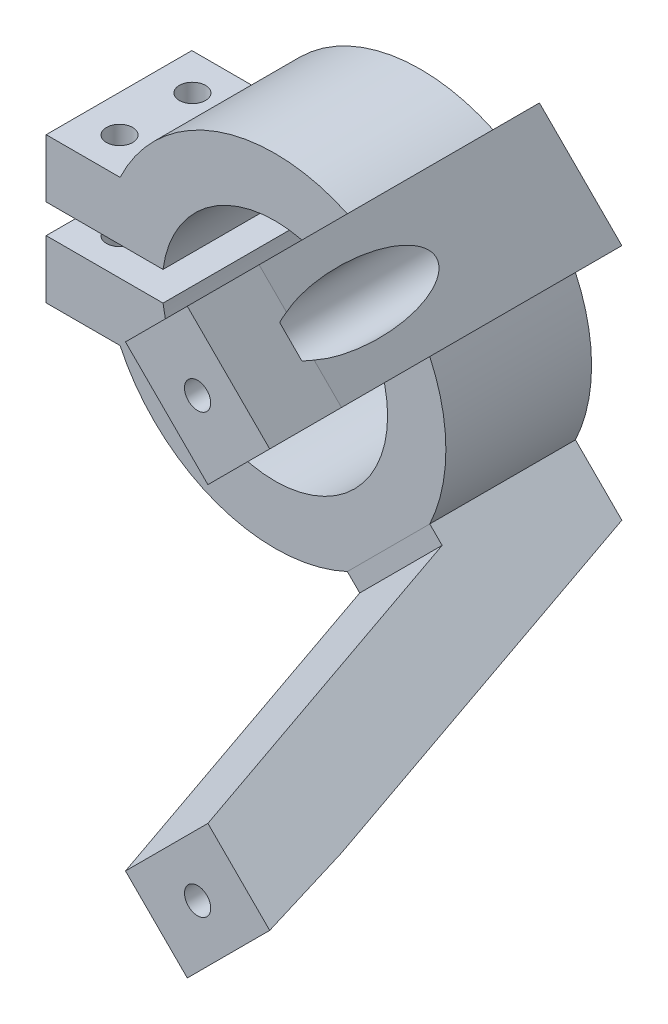
ISO-10303-21;
HEADER;
FILE_DESCRIPTION(('STEP AP214'),'2;1');
FILE_NAME('part.step','',(''),(''),'','','');
FILE_SCHEMA(('AUTOMOTIVE_DESIGN { 1 0 10303 214 1 1 1 1 }'));
ENDSEC;
DATA;
#1=APPLICATION_CONTEXT('core data for automotive mechanical design processes');
#2=APPLICATION_PROTOCOL_DEFINITION('international standard','automotive_design',2000,#1);
#3=PRODUCT_CONTEXT('',#1,'mechanical');
#4=PRODUCT('Part','Part','',(#3));
#5=PRODUCT_RELATED_PRODUCT_CATEGORY('part','',(#4));
#6=PRODUCT_DEFINITION_FORMATION('','',#4);
#7=PRODUCT_DEFINITION_CONTEXT('part definition',#1,'design');
#8=PRODUCT_DEFINITION('design','',#6,#7);
#9=PRODUCT_DEFINITION_SHAPE('','',#8);
#10=(LENGTH_UNIT() NAMED_UNIT(*) SI_UNIT(.MILLI.,.METRE.));
#11=(NAMED_UNIT(*) PLANE_ANGLE_UNIT() SI_UNIT($,.RADIAN.));
#12=(NAMED_UNIT(*) SI_UNIT($,.STERADIAN.) SOLID_ANGLE_UNIT());
#13=UNCERTAINTY_MEASURE_WITH_UNIT(LENGTH_MEASURE(1.E-05),#10,'distance_accuracy_value','');
#14=(GEOMETRIC_REPRESENTATION_CONTEXT(3) GLOBAL_UNCERTAINTY_ASSIGNED_CONTEXT((#13)) GLOBAL_UNIT_ASSIGNED_CONTEXT((#10,
#11,#12)) REPRESENTATION_CONTEXT('',''));
#15=CARTESIAN_POINT('',(0.,0.,0.));
#16=DIRECTION('',(0.,0.,1.));
#17=DIRECTION('',(1.,0.,0.));
#18=AXIS2_PLACEMENT_3D('',#15,#16,#17);
#19=CARTESIAN_POINT('',(0.,0.,25.));
#20=DIRECTION('',(0.,0.,-1.));
#21=DIRECTION('',(-1.,0.,0.));
#22=AXIS2_PLACEMENT_3D('',#19,#20,#21);
#23=CYLINDRICAL_SURFACE('',#22,29.35);
#24=CARTESIAN_POINT('',(0.,0.,0.));
#25=DIRECTION('',(0.,0.,1.));
#26=DIRECTION('',(1.,0.,0.));
#27=AXIS2_PLACEMENT_3D('',#24,#25,#26);
#28=CIRCLE('',#27,29.35);
#29=CARTESIAN_POINT('',(12.440755526818,26.5828911505492,0.));
#30=VERTEX_POINT('',#29);
#31=CARTESIAN_POINT('',(-26.5550842589513,12.5,0.));
#32=VERTEX_POINT('',#31);
#33=EDGE_CURVE('E428',#30,#32,#28,.T.);
#34=ORIENTED_EDGE('',*,*,#33,.T.);
#35=DIRECTION('',(0.,0.,-1.));
#36=VECTOR('',#35,1.);
#37=CARTESIAN_POINT('',(-26.5550842589513,12.5,41.1552358475441));
#38=LINE('',#37,#36);
#39=CARTESIAN_POINT('',(-26.5550842589513,12.5,25.));
#40=VERTEX_POINT('',#39);
#41=EDGE_CURVE('E375',#40,#32,#38,.T.);
#42=ORIENTED_EDGE('',*,*,#41,.F.);
#43=CARTESIAN_POINT('',(0.,0.,25.));
#44=DIRECTION('',(0.,0.,1.));
#45=DIRECTION('',(1.,0.,0.));
#46=AXIS2_PLACEMENT_3D('',#43,#44,#45);
#47=CIRCLE('',#46,29.35);
#48=CARTESIAN_POINT('',(12.440755526818,26.5828911505492,25.));
#49=VERTEX_POINT('',#48);
#50=EDGE_CURVE('E423',#49,#40,#47,.T.);
#51=ORIENTED_EDGE('',*,*,#50,.F.);
#52=DIRECTION('',(0.,0.,-1.));
#53=VECTOR('',#52,1.);
#54=CARTESIAN_POINT('',(12.440755526818,26.5828911505492,47.9999999999998));
#55=LINE('',#54,#53);
#56=EDGE_CURVE('E456',#49,#30,#55,.T.);
#57=ORIENTED_EDGE('',*,*,#56,.T.);
#58=EDGE_LOOP('',(#34,#42,#51,#57));
#59=FACE_BOUND('',#58,.T.);
#60=ADVANCED_FACE('F40',(#59),#23,.T.);
#61=CARTESIAN_POINT('',(37.54304625894,37.5430462589407,0.));
#62=DIRECTION('',(0.,0.,1.));
#63=DIRECTION('',(0.,1.,0.));
#64=AXIS2_PLACEMENT_3D('',#61,#62,#63);
#65=CYLINDRICAL_SURFACE('',#64,2.25);
#66=CARTESIAN_POINT('',(37.54304625894,37.5430462589407,75.8));
#67=DIRECTION('',(0.,0.,1.));
#68=DIRECTION('',(0.,1.,0.));
#69=AXIS2_PLACEMENT_3D('',#66,#67,#68);
#70=CIRCLE('',#69,2.25);
#71=CARTESIAN_POINT('',(37.54304625894,39.7930462589407,75.8));
#72=VERTEX_POINT('',#71);
#73=EDGE_CURVE('E470',#72,#72,#70,.T.);
#74=ORIENTED_EDGE('',*,*,#73,.T.);
#75=EDGE_LOOP('',(#74));
#76=FACE_BOUND('',#75,.T.);
#77=CARTESIAN_POINT('',(37.54304625894,37.5430462589407,62.7999999999998));
#78=DIRECTION('',(0.,0.,-1.));
#79=DIRECTION('',(0.,-1.,0.));
#80=AXIS2_PLACEMENT_3D('',#77,#78,#79);
#81=CIRCLE('',#80,2.25);
#82=CARTESIAN_POINT('',(37.54304625894,35.2930462589407,62.7999999999998));
#83=VERTEX_POINT('',#82);
#84=EDGE_CURVE('E530',#83,#83,#81,.F.);
#85=ORIENTED_EDGE('',*,*,#84,.F.);
#86=EDGE_LOOP('',(#85));
#87=FACE_BOUND('',#86,.T.);
#88=ADVANCED_FACE('F42',(#76,#87),#65,.F.);
#89=CARTESIAN_POINT('',(26.582891150549,12.4407555268184,47.9999999999998));
#90=DIRECTION('',(0.707106781186555,-0.70710678118654,0.));
#91=DIRECTION('',(0.70710678118654,0.707106781186555,0.));
#92=AXIS2_PLACEMENT_3D('',#89,#90,#91);
#93=PLANE('',#92);
#94=DIRECTION('',(-0.173170985129482,-0.173170985129486,-0.969548152398099));
#95=VECTOR('',#94,1.);
#96=CARTESIAN_POINT('',(43.8503411388346,29.7082055151043,41.8317218845716));
#97=LINE('',#96,#95);
#98=CARTESIAN_POINT('',(49.9174149297046,35.7752793059745,75.8));
#99=VERTEX_POINT('',#98);
#100=CARTESIAN_POINT('',(47.2382650901455,33.0961294664153,60.8));
#101=VERTEX_POINT('',#100);
#102=EDGE_CURVE('E515',#99,#101,#97,.T.);
#103=ORIENTED_EDGE('',*,*,#102,.F.);
#104=DIRECTION('',(0.70710678118654,0.707106781186555,0.));
#105=VECTOR('',#104,1.);
#106=CARTESIAN_POINT('',(39.3108132119066,25.1686775881762,75.8));
#107=LINE('',#106,#105);
#108=CARTESIAN_POINT('',(39.3108132119065,25.1686775881762,75.8));
#109=VERTEX_POINT('',#108);
#110=EDGE_CURVE('E478',#109,#99,#107,.T.);
#111=ORIENTED_EDGE('',*,*,#110,.F.);
#112=DIRECTION('',(0.200244358214704,0.200244358214708,0.959064332569177));
#113=VECTOR('',#112,1.);
#114=CARTESIAN_POINT('',(28.7042114941086,14.562075870378,25.));
#115=LINE('',#114,#113);
#116=CARTESIAN_POINT('',(28.7042114941086,14.5620758703781,25.));
#117=VERTEX_POINT('',#116);
#118=EDGE_CURVE('E488',#117,#109,#115,.T.);
#119=ORIENTED_EDGE('',*,*,#118,.F.);
#120=DIRECTION('',(-0.70710678118654,-0.707106781186555,0.));
#121=VECTOR('',#120,1.);
#122=CARTESIAN_POINT('',(26.582891150549,12.4407555268184,25.));
#123=LINE('',#122,#121);
#124=CARTESIAN_POINT('',(26.582891150549,12.4407555268184,25.));
#125=VERTEX_POINT('',#124);
#126=EDGE_CURVE('E496',#117,#125,#123,.T.);
#127=ORIENTED_EDGE('',*,*,#126,.T.);
#128=DIRECTION('',(0.,0.,-1.));
#129=VECTOR('',#128,1.);
#130=CARTESIAN_POINT('',(26.582891150549,12.4407555268184,47.9999999999998));
#131=LINE('',#130,#129);
#132=CARTESIAN_POINT('',(26.582891150549,12.4407555268184,0.));
#133=VERTEX_POINT('',#132);
#134=EDGE_CURVE('E11',#125,#133,#131,.T.);
#135=ORIENTED_EDGE('',*,*,#134,.T.);
#136=DIRECTION('',(-0.70710678118654,-0.707106781186555,0.));
#137=VECTOR('',#136,1.);
#138=CARTESIAN_POINT('',(26.582891150549,12.4407555268184,0.));
#139=LINE('',#138,#137);
#140=CARTESIAN_POINT('',(34.5437496483714,20.4016140246409,0.));
#141=VERTEX_POINT('',#140);
#142=EDGE_CURVE('E49',#141,#133,#139,.T.);
#143=ORIENTED_EDGE('',*,*,#142,.F.);
#144=DIRECTION('',(-0.200244358214707,-0.200244358214711,-0.959064332569176));
#145=VECTOR('',#144,1.);
#146=CARTESIAN_POINT('',(34.5437496483714,20.4016140246409,0.));
#147=LINE('',#146,#145);
#148=EDGE_CURVE('E507',#101,#141,#147,.T.);
#149=ORIENTED_EDGE('',*,*,#148,.F.);
#150=EDGE_LOOP('',(#103,#111,#119,#127,#135,#143,#149));
#151=FACE_BOUND('',#150,.T.);
#152=ADVANCED_FACE('F546',(#151),#93,.T.);
#153=CARTESIAN_POINT('',(0.,0.,0.));
#154=DIRECTION('',(0.,0.,1.));
#155=DIRECTION('',(1.,0.,0.));
#156=AXIS2_PLACEMENT_3D('',#153,#154,#155);
#157=PLANE('',#156);
#158=DIRECTION('',(0.707106781186554,-0.707106781186541,0.));
#159=VECTOR('',#158,1.);
#160=CARTESIAN_POINT('',(19.5118233386835,19.5118233386838,0.));
#161=LINE('',#160,#159);
#162=EDGE_CURVE('E534',#30,#133,#161,.T.);
#163=ORIENTED_EDGE('',*,*,#162,.F.);
#164=DIRECTION('',(0.70710678118654,0.707106781186555,0.));
#165=VECTOR('',#164,1.);
#166=CARTESIAN_POINT('',(14.5620758703773,28.7042114941087,0.));
#167=LINE('',#166,#165);
#168=CARTESIAN_POINT('',(20.4016140246403,34.5437496483717,0.));
#169=VERTEX_POINT('',#168);
#170=EDGE_CURVE('E452',#30,#169,#167,.T.);
#171=ORIENTED_EDGE('',*,*,#170,.T.);
#172=DIRECTION('',(-0.707106781186555,0.70710678118654,0.));
#173=VECTOR('',#172,1.);
#174=CARTESIAN_POINT('',(92.1876565249881,-37.2422928519746,0.));
#175=LINE('',#174,#173);
#176=EDGE_CURVE('E511',#141,#169,#175,.T.);
#177=ORIENTED_EDGE('',*,*,#176,.F.);
#178=ORIENTED_EDGE('',*,*,#142,.T.);
#179=EDGE_LOOP('',(#163,#171,#177,#178));
#180=FACE_BOUND('',#179,.T.);
#181=ADVANCED_FACE('F542',(#180),#157,.F.);
#182=CARTESIAN_POINT('',(37.54304625894,37.5430462589407,62.7999999999998));
#183=DIRECTION('',(0.,0.,-1.));
#184=DIRECTION('',(0.,-1.,0.));
#185=AXIS2_PLACEMENT_3D('',#182,#183,#184);
#186=PLANE('',#185);
#187=DIRECTION('',(-0.707106781186555,0.70710678118654,0.));
#188=VECTOR('',#187,1.);
#189=CARTESIAN_POINT('',(40.5244172568878,40.5244172568885,62.7999999999998));
#190=LINE('',#189,#188);
#191=CARTESIAN_POINT('',(42.4247927388901,38.6240417748862,62.7999999999998));
#192=VERTEX_POINT('',#191);
#193=CARTESIAN_POINT('',(38.6240417748854,42.4247927388908,62.7999999999998));
#194=VERTEX_POINT('',#193);
#195=EDGE_CURVE('E64',#192,#194,#190,.T.);
#196=ORIENTED_EDGE('',*,*,#195,.F.);
#197=CARTESIAN_POINT('',(37.54304625894,37.5430462589407,62.7999999999998));
#198=DIRECTION('',(0.,0.,-1.));
#199=DIRECTION('',(0.,-1.,0.));
#200=AXIS2_PLACEMENT_3D('',#197,#198,#199);
#201=CIRCLE('',#200,5.00000000000001);
#202=EDGE_CURVE('E526',#192,#194,#201,.T.);
#203=ORIENTED_EDGE('',*,*,#202,.T.);
#204=EDGE_LOOP('',(#196,#203));
#205=FACE_BOUND('',#204,.T.);
#206=ORIENTED_EDGE('',*,*,#84,.T.);
#207=EDGE_LOOP('',(#206));
#208=FACE_BOUND('',#207,.T.);
#209=ADVANCED_FACE('F690',(#205,#208),#186,.T.);
#210=CARTESIAN_POINT('',(37.54304625894,37.5430462589407,62.7999999999998));
#211=DIRECTION('',(0.,0.,-1.));
#212=DIRECTION('',(0.,-1.,0.));
#213=AXIS2_PLACEMENT_3D('',#210,#211,#212);
#214=CYLINDRICAL_SURFACE('',#213,5.00000000000001);
#215=CARTESIAN_POINT('',(37.54304625894,37.5430462589407,48.2317075978466));
#216=DIRECTION('',(0.678160893153807,0.678160893153821,-0.283188287175938));
#217=DIRECTION('',(-0.200244358214707,-0.200244358214711,-0.959064332569176));
#218=AXIS2_PLACEMENT_3D('',#215,#216,#217);
#219=ELLIPSE('',#218,17.6560974673844,5.00000000000001);
#220=CARTESIAN_POINT('',(42.5365498117154,37.7978447448453,60.8));
#221=VERTEX_POINT('',#220);
#222=CARTESIAN_POINT('',(37.7978447448445,42.5365498117161,60.8));
#223=VERTEX_POINT('',#222);
#224=EDGE_CURVE('E500',#221,#223,#219,.T.);
#225=ORIENTED_EDGE('',*,*,#224,.T.);
#226=CARTESIAN_POINT('',(37.54304625894,37.5430462589407,46.1079268994614));
#227=DIRECTION('',(-0.685574073247577,-0.685574073247592,0.244900755779626));
#228=DIRECTION('',(-0.173170985129482,-0.173170985129486,-0.969548152398099));
#229=AXIS2_PLACEMENT_3D('',#226,#227,#228);
#230=ELLIPSE('',#229,20.4164335225623,5.00000000000001);
#231=EDGE_CURVE('E523',#223,#194,#230,.F.);
#232=ORIENTED_EDGE('',*,*,#231,.T.);
#233=ORIENTED_EDGE('',*,*,#202,.F.);
#234=EDGE_CURVE('E519',#192,#221,#230,.F.);
#235=ORIENTED_EDGE('',*,*,#234,.T.);
#236=EDGE_LOOP('',(#225,#232,#233,#235));
#237=FACE_BOUND('',#236,.T.);
#238=ADVANCED_FACE('F687',(#237),#214,.F.);
#239=CARTESIAN_POINT('',(84.7475710298458,-4.41317647328423,60.8));
#240=DIRECTION('',(-0.685574073247577,-0.685574073247592,0.244900755779626));
#241=DIRECTION('',(0.707106781186555,-0.70710678118654,0.));
#242=AXIS2_PLACEMENT_3D('',#239,#240,#241);
#243=PLANE('',#242);
#244=ORIENTED_EDGE('',*,*,#102,.T.);
#245=DIRECTION('',(-0.707106781186555,0.70710678118654,0.));
#246=VECTOR('',#245,1.);
#247=CARTESIAN_POINT('',(104.882171966762,-24.5477774102002,60.8));
#248=LINE('',#247,#246);
#249=EDGE_CURVE('E503',#101,#221,#248,.T.);
#250=ORIENTED_EDGE('',*,*,#249,.T.);
#251=ORIENTED_EDGE('',*,*,#234,.F.);
#252=ORIENTED_EDGE('',*,*,#195,.T.);
#253=ORIENTED_EDGE('',*,*,#231,.F.);
#254=CARTESIAN_POINT('',(33.0961294664144,47.2382650901461,60.8));
#255=VERTEX_POINT('',#254);
#256=EDGE_CURVE('E508',#223,#255,#248,.T.);
#257=ORIENTED_EDGE('',*,*,#256,.T.);
#258=DIRECTION('',(0.173170985129482,0.173170985129486,0.969548152398099));
#259=VECTOR('',#258,1.);
#260=CARTESIAN_POINT('',(33.0961294664144,47.2382650901461,60.8));
#261=LINE('',#260,#259);
#262=CARTESIAN_POINT('',(35.7752793059735,49.9174149297053,75.8));
#263=VERTEX_POINT('',#262);
#264=EDGE_CURVE('E446',#255,#263,#261,.T.);
#265=ORIENTED_EDGE('',*,*,#264,.T.);
#266=DIRECTION('',(-0.707106781186555,0.70710678118654,0.));
#267=VECTOR('',#266,1.);
#268=CARTESIAN_POINT('',(107.561321806321,-21.868627570641,75.8));
#269=LINE('',#268,#267);
#270=EDGE_CURVE('E481',#99,#263,#269,.T.);
#271=ORIENTED_EDGE('',*,*,#270,.F.);
#272=EDGE_LOOP('',(#244,#250,#251,#252,#253,#257,#265,#271));
#273=FACE_BOUND('',#272,.T.);
#274=ADVANCED_FACE('F683',(#273),#243,.F.);
#275=CARTESIAN_POINT('',(92.1876565249881,-37.2422928519746,0.));
#276=DIRECTION('',(0.678160893153807,0.678160893153821,-0.283188287175938));
#277=DIRECTION('',(-0.707106781186555,0.70710678118654,0.));
#278=AXIS2_PLACEMENT_3D('',#275,#276,#277);
#279=PLANE('',#278);
#280=ORIENTED_EDGE('',*,*,#224,.F.);
#281=ORIENTED_EDGE('',*,*,#249,.F.);
#282=ORIENTED_EDGE('',*,*,#148,.T.);
#283=ORIENTED_EDGE('',*,*,#176,.T.);
#284=DIRECTION('',(-0.200244358214707,-0.200244358214711,-0.959064332569176));
#285=VECTOR('',#284,1.);
#286=CARTESIAN_POINT('',(20.4016140246403,34.5437496483717,0.));
#287=LINE('',#286,#285);
#288=EDGE_CURVE('E449',#255,#169,#287,.T.);
#289=ORIENTED_EDGE('',*,*,#288,.F.);
#290=ORIENTED_EDGE('',*,*,#256,.F.);
#291=EDGE_LOOP('',(#280,#281,#282,#283,#289,#290));
#292=FACE_BOUND('',#291,.T.);
#293=ADVANCED_FACE('F663',(#292),#279,.T.);
#294=CARTESIAN_POINT('',(0.,0.,25.));
#295=DIRECTION('',(0.,0.,1.));
#296=DIRECTION('',(1.,0.,0.));
#297=AXIS2_PLACEMENT_3D('',#294,#295,#296);
#298=PLANE('',#297);
#299=DIRECTION('',(0.70710678118654,0.707106781186555,0.));
#300=VECTOR('',#299,1.);
#301=CARTESIAN_POINT('',(14.5620758703773,28.7042114941087,25.));
#302=LINE('',#301,#300);
#303=CARTESIAN_POINT('',(14.5620758703773,28.7042114941087,25.));
#304=VERTEX_POINT('',#303);
#305=EDGE_CURVE('E460',#49,#304,#302,.T.);
#306=ORIENTED_EDGE('',*,*,#305,.F.);
#307=DIRECTION('',(0.707106781186554,-0.707106781186542,0.));
#308=VECTOR('',#307,1.);
#309=CARTESIAN_POINT('',(19.5118233386835,19.5118233386838,25.));
#310=LINE('',#309,#308);
#311=EDGE_CURVE('E492',#49,#125,#310,.T.);
#312=ORIENTED_EDGE('',*,*,#311,.T.);
#313=ORIENTED_EDGE('',*,*,#126,.F.);
#314=DIRECTION('',(0.707106781186566,-0.707106781186529,0.));
#315=VECTOR('',#314,1.);
#316=CARTESIAN_POINT('',(28.7042114941086,14.5620758703781,25.));
#317=LINE('',#316,#315);
#318=EDGE_CURVE('E485',#304,#117,#317,.T.);
#319=ORIENTED_EDGE('',*,*,#318,.F.);
#320=EDGE_LOOP('',(#306,#312,#313,#319));
#321=FACE_BOUND('',#320,.T.);
#322=ADVANCED_FACE('F656',(#321),#298,.T.);
#323=CARTESIAN_POINT('',(86.3481183707253,-43.0818310062375,25.));
#324=DIRECTION('',(-0.678160893153808,-0.678160893153822,0.283188287175934));
#325=DIRECTION('',(0.707106781186555,-0.70710678118654,0.));
#326=AXIS2_PLACEMENT_3D('',#323,#324,#325);
#327=PLANE('',#326);
#328=ORIENTED_EDGE('',*,*,#318,.T.);
#329=ORIENTED_EDGE('',*,*,#118,.T.);
#330=DIRECTION('',(-0.707106781186555,0.70710678118654,0.));
#331=VECTOR('',#330,1.);
#332=CARTESIAN_POINT('',(96.9547200885233,-32.4752292884394,75.8));
#333=LINE('',#332,#331);
#334=CARTESIAN_POINT('',(25.1686775881754,39.310813211907,75.8));
#335=VERTEX_POINT('',#334);
#336=EDGE_CURVE('E474',#109,#335,#333,.T.);
#337=ORIENTED_EDGE('',*,*,#336,.T.);
#338=DIRECTION('',(0.200244358214704,0.200244358214708,0.959064332569177));
#339=VECTOR('',#338,1.);
#340=CARTESIAN_POINT('',(14.5620758703775,28.7042114941088,25.));
#341=LINE('',#340,#339);
#342=EDGE_CURVE('E463',#304,#335,#341,.T.);
#343=ORIENTED_EDGE('',*,*,#342,.F.);
#344=EDGE_LOOP('',(#328,#329,#337,#343));
#345=FACE_BOUND('',#344,.T.);
#346=ADVANCED_FACE('F662',(#345),#327,.T.);
#347=CARTESIAN_POINT('',(96.9547200885233,-32.4752292884394,75.8));
#348=DIRECTION('',(0.,0.,1.));
#349=DIRECTION('',(0.,1.,0.));
#350=AXIS2_PLACEMENT_3D('',#347,#348,#349);
#351=PLANE('',#350);
#352=ORIENTED_EDGE('',*,*,#73,.F.);
#353=EDGE_LOOP('',(#352));
#354=FACE_BOUND('',#353,.T.);
#355=ORIENTED_EDGE('',*,*,#336,.F.);
#356=ORIENTED_EDGE('',*,*,#110,.T.);
#357=ORIENTED_EDGE('',*,*,#270,.T.);
#358=DIRECTION('',(0.70710678118654,0.707106781186555,0.));
#359=VECTOR('',#358,1.);
#360=CARTESIAN_POINT('',(25.1686775881754,39.310813211907,75.8));
#361=LINE('',#360,#359);
#362=EDGE_CURVE('E466',#335,#263,#361,.T.);
#363=ORIENTED_EDGE('',*,*,#362,.F.);
#364=EDGE_LOOP('',(#355,#356,#357,#363));
#365=FACE_BOUND('',#364,.T.);
#366=ADVANCED_FACE('F670',(#354,#365),#351,.T.);
#367=CARTESIAN_POINT('',(14.5620758703773,28.7042114941087,47.9999999999998));
#368=DIRECTION('',(-0.707106781186555,0.70710678118654,0.));
#369=DIRECTION('',(-0.70710678118654,-0.707106781186555,0.));
#370=AXIS2_PLACEMENT_3D('',#367,#368,#369);
#371=PLANE('',#370);
#372=ORIENTED_EDGE('',*,*,#264,.F.);
#373=ORIENTED_EDGE('',*,*,#288,.T.);
#374=ORIENTED_EDGE('',*,*,#170,.F.);
#375=ORIENTED_EDGE('',*,*,#56,.F.);
#376=ORIENTED_EDGE('',*,*,#305,.T.);
#377=ORIENTED_EDGE('',*,*,#342,.T.);
#378=ORIENTED_EDGE('',*,*,#362,.T.);
#379=EDGE_LOOP('',(#372,#373,#374,#375,#376,#377,#378));
#380=FACE_BOUND('',#379,.T.);
#381=ADVANCED_FACE('F666',(#380),#371,.T.);
#382=DIRECTION('',(0.707106781186553,-0.707106781186542,0.));
#383=VECTOR('',#382,1.);
#384=CARTESIAN_POINT('',(28.7042114941086,-14.5620758703774,25.));
#385=LINE('',#384,#383);
#386=CARTESIAN_POINT('',(26.5828911505492,-12.440755526818,25.));
#387=VERTEX_POINT('',#386);
#388=CARTESIAN_POINT('',(28.7042114941086,-14.5620758703774,25.));
#389=VERTEX_POINT('',#388);
#390=EDGE_CURVE('E283',#387,#389,#385,.T.);
#391=ORIENTED_EDGE('',*,*,#390,.F.);
#392=DIRECTION('',(-0.707106781186544,-0.707106781186551,0.));
#393=VECTOR('',#392,1.);
#394=CARTESIAN_POINT('',(19.5118233386838,-19.5118233386836,25.));
#395=LINE('',#394,#393);
#396=CARTESIAN_POINT('',(12.4407555268183,-26.5828911505491,25.));
#397=VERTEX_POINT('',#396);
#398=EDGE_CURVE('E443',#387,#397,#395,.T.);
#399=ORIENTED_EDGE('',*,*,#398,.T.);
#400=DIRECTION('',(-0.707106781186552,0.707106781186543,0.));
#401=VECTOR('',#400,1.);
#402=CARTESIAN_POINT('',(12.4407555268183,-26.5828911505491,25.));
#403=LINE('',#402,#401);
#404=CARTESIAN_POINT('',(14.562075870378,-28.7042114941087,25.));
#405=VERTEX_POINT('',#404);
#406=EDGE_CURVE('E290',#405,#397,#403,.T.);
#407=ORIENTED_EDGE('',*,*,#406,.F.);
#408=DIRECTION('',(-0.707106781186532,-0.707106781186563,0.));
#409=VECTOR('',#408,1.);
#410=CARTESIAN_POINT('',(14.562075870378,-28.7042114941087,25.));
#411=LINE('',#410,#409);
#412=EDGE_CURVE('E289',#389,#405,#411,.T.);
#413=ORIENTED_EDGE('',*,*,#412,.F.);
#414=EDGE_LOOP('',(#391,#399,#407,#413));
#415=FACE_BOUND('',#414,.T.);
#416=ADVANCED_FACE('F557',(#415),#298,.T.);
#417=DIRECTION('',(-0.707106781186544,-0.707106781186551,0.));
#418=VECTOR('',#417,1.);
#419=CARTESIAN_POINT('',(19.5118233386838,-19.5118233386836,0.));
#420=LINE('',#419,#418);
#421=CARTESIAN_POINT('',(26.5828911505492,-12.440755526818,0.));
#422=VERTEX_POINT('',#421);
#423=CARTESIAN_POINT('',(12.4407555268183,-26.5828911505491,0.));
#424=VERTEX_POINT('',#423);
#425=EDGE_CURVE('E440',#422,#424,#420,.T.);
#426=ORIENTED_EDGE('',*,*,#425,.F.);
#427=DIRECTION('',(0.707106781186553,-0.707106781186542,0.));
#428=VECTOR('',#427,1.);
#429=CARTESIAN_POINT('',(28.7042114941086,-14.5620758703774,0.));
#430=LINE('',#429,#428);
#431=CARTESIAN_POINT('',(34.5437496483716,-20.4016140246404,0.));
#432=VERTEX_POINT('',#431);
#433=EDGE_CURVE('E272',#422,#432,#430,.T.);
#434=ORIENTED_EDGE('',*,*,#433,.T.);
#435=DIRECTION('',(0.707106781186543,0.707106781186552,0.));
#436=VECTOR('',#435,1.);
#437=CARTESIAN_POINT('',(-37.242292851975,-92.187656524988,0.));
#438=LINE('',#437,#436);
#439=CARTESIAN_POINT('',(20.4016140246408,-34.5437496483714,0.));
#440=VERTEX_POINT('',#439);
#441=EDGE_CURVE('E247',#440,#432,#438,.T.);
#442=ORIENTED_EDGE('',*,*,#441,.F.);
#443=DIRECTION('',(-0.707106781186552,0.707106781186543,0.));
#444=VECTOR('',#443,1.);
#445=CARTESIAN_POINT('',(12.4407555268183,-26.5828911505491,0.));
#446=LINE('',#445,#444);
#447=EDGE_CURVE('E279',#440,#424,#446,.T.);
#448=ORIENTED_EDGE('',*,*,#447,.T.);
#449=EDGE_LOOP('',(#426,#434,#442,#448));
#450=FACE_BOUND('',#449,.T.);
#451=ADVANCED_FACE('F561',(#450),#157,.F.);
#452=CARTESIAN_POINT('',(37.5430462589406,-37.5430462589402,0.));
#453=DIRECTION('',(0.,0.,1.));
#454=DIRECTION('',(1.,0.,0.));
#455=AXIS2_PLACEMENT_3D('',#452,#453,#454);
#456=CYLINDRICAL_SURFACE('',#455,2.25);
#457=CARTESIAN_POINT('',(37.5430462589406,-37.5430462589402,75.8));
#458=DIRECTION('',(0.,0.,1.));
#459=DIRECTION('',(1.,0.,0.));
#460=AXIS2_PLACEMENT_3D('',#457,#458,#459);
#461=CIRCLE('',#460,2.25);
#462=CARTESIAN_POINT('',(39.7930462589406,-37.5430462589402,75.8));
#463=VERTEX_POINT('',#462);
#464=EDGE_CURVE('E259',#463,#463,#461,.T.);
#465=ORIENTED_EDGE('',*,*,#464,.T.);
#466=EDGE_LOOP('',(#465));
#467=FACE_BOUND('',#466,.T.);
#468=CARTESIAN_POINT('',(37.5430462589406,-37.5430462589402,62.7999999999998));
#469=DIRECTION('',(0.,0.,-1.));
#470=DIRECTION('',(-1.,0.,0.));
#471=AXIS2_PLACEMENT_3D('',#468,#469,#470);
#472=CIRCLE('',#471,2.25);
#473=CARTESIAN_POINT('',(35.2930462589406,-37.5430462589402,62.7999999999998));
#474=VERTEX_POINT('',#473);
#475=EDGE_CURVE('E429',#474,#474,#472,.F.);
#476=ORIENTED_EDGE('',*,*,#475,.F.);
#477=EDGE_LOOP('',(#476));
#478=FACE_BOUND('',#477,.T.);
#479=ADVANCED_FACE('F632',(#467,#478),#456,.F.);
#480=EDGE_CURVE('E56',#422,#133,#28,.T.);
#481=ORIENTED_EDGE('',*,*,#480,.T.);
#482=ORIENTED_EDGE('',*,*,#134,.F.);
#483=EDGE_CURVE('E422',#387,#125,#47,.T.);
#484=ORIENTED_EDGE('',*,*,#483,.F.);
#485=DIRECTION('',(0.,0.,-1.));
#486=VECTOR('',#485,1.);
#487=CARTESIAN_POINT('',(26.5828911505492,-12.440755526818,47.9999999999998));
#488=LINE('',#487,#486);
#489=EDGE_CURVE('E301',#387,#422,#488,.T.);
#490=ORIENTED_EDGE('',*,*,#489,.T.);
#491=EDGE_LOOP('',(#481,#482,#484,#490));
#492=FACE_BOUND('',#491,.T.);
#493=ADVANCED_FACE('F550',(#492),#23,.T.);
#494=CARTESIAN_POINT('',(-26.5550842589513,-12.5,0.));
#495=VERTEX_POINT('',#494);
#496=EDGE_CURVE('E424',#495,#424,#28,.T.);
#497=ORIENTED_EDGE('',*,*,#496,.T.);
#498=DIRECTION('',(0.,0.,-1.));
#499=VECTOR('',#498,1.);
#500=CARTESIAN_POINT('',(12.4407555268183,-26.5828911505491,47.9999999999998));
#501=LINE('',#500,#499);
#502=EDGE_CURVE('E294',#397,#424,#501,.T.);
#503=ORIENTED_EDGE('',*,*,#502,.F.);
#504=CARTESIAN_POINT('',(-26.5550842589513,-12.5,25.));
#505=VERTEX_POINT('',#504);
#506=EDGE_CURVE('E417',#505,#397,#47,.T.);
#507=ORIENTED_EDGE('',*,*,#506,.F.);
#508=DIRECTION('',(0.,0.,-1.));
#509=VECTOR('',#508,1.);
#510=CARTESIAN_POINT('',(-26.5550842589513,-12.5,41.1552358475441));
#511=LINE('',#510,#509);
#512=EDGE_CURVE('E357',#505,#495,#511,.T.);
#513=ORIENTED_EDGE('',*,*,#512,.T.);
#514=EDGE_LOOP('',(#497,#503,#507,#513));
#515=FACE_BOUND('',#514,.T.);
#516=ADVANCED_FACE('F601',(#515),#23,.T.);
#517=ORIENTED_EDGE('',*,*,#483,.T.);
#518=ORIENTED_EDGE('',*,*,#311,.F.);
#519=ORIENTED_EDGE('',*,*,#50,.T.);
#520=DIRECTION('',(1.,0.,0.));
#521=VECTOR('',#520,1.);
#522=CARTESIAN_POINT('',(-39.243332573426,12.5,25.));
#523=LINE('',#522,#521);
#524=CARTESIAN_POINT('',(-39.243332573426,12.5,25.));
#525=VERTEX_POINT('',#524);
#526=EDGE_CURVE('E371',#525,#40,#523,.T.);
#527=ORIENTED_EDGE('',*,*,#526,.F.);
#528=DIRECTION('',(0.,1.,0.));
#529=VECTOR('',#528,1.);
#530=CARTESIAN_POINT('',(-39.243332573426,2.5,25.));
#531=LINE('',#530,#529);
#532=CARTESIAN_POINT('',(-39.243332573426,2.5,25.));
#533=VERTEX_POINT('',#532);
#534=EDGE_CURVE('E377',#533,#525,#531,.T.);
#535=ORIENTED_EDGE('',*,*,#534,.F.);
#536=DIRECTION('',(1.,0.,0.));
#537=VECTOR('',#536,1.);
#538=CARTESIAN_POINT('',(-29.35,2.5,25.));
#539=LINE('',#538,#537);
#540=CARTESIAN_POINT('',(-19.1878216585417,2.5,25.));
#541=VERTEX_POINT('',#540);
#542=EDGE_CURVE('E390',#533,#541,#539,.T.);
#543=ORIENTED_EDGE('',*,*,#542,.T.);
#544=CARTESIAN_POINT('',(0.,0.,25.));
#545=DIRECTION('',(0.,0.,1.));
#546=DIRECTION('',(1.,0.,0.));
#547=AXIS2_PLACEMENT_3D('',#544,#545,#546);
#548=CIRCLE('',#547,19.35);
#549=CARTESIAN_POINT('',(-19.1878216585417,-2.5,25.));
#550=VERTEX_POINT('',#549);
#551=EDGE_CURVE('E410',#550,#541,#548,.T.);
#552=ORIENTED_EDGE('',*,*,#551,.F.);
#553=DIRECTION('',(-1.,0.,0.));
#554=VECTOR('',#553,1.);
#555=CARTESIAN_POINT('',(-19.1878216585417,-2.5,25.));
#556=LINE('',#555,#554);
#557=CARTESIAN_POINT('',(-39.243332573426,-2.5,25.));
#558=VERTEX_POINT('',#557);
#559=EDGE_CURVE('E394',#550,#558,#556,.T.);
#560=ORIENTED_EDGE('',*,*,#559,.T.);
#561=DIRECTION('',(0.,1.,0.));
#562=VECTOR('',#561,1.);
#563=CARTESIAN_POINT('',(-39.243332573426,-2.5,25.));
#564=LINE('',#563,#562);
#565=CARTESIAN_POINT('',(-39.243332573426,-12.5,25.));
#566=VERTEX_POINT('',#565);
#567=EDGE_CURVE('E349',#566,#558,#564,.T.);
#568=ORIENTED_EDGE('',*,*,#567,.F.);
#569=DIRECTION('',(-1.,0.,0.));
#570=VECTOR('',#569,1.);
#571=CARTESIAN_POINT('',(-39.243332573426,-12.5,25.));
#572=LINE('',#571,#570);
#573=EDGE_CURVE('E341',#505,#566,#572,.T.);
#574=ORIENTED_EDGE('',*,*,#573,.F.);
#575=ORIENTED_EDGE('',*,*,#506,.T.);
#576=ORIENTED_EDGE('',*,*,#398,.F.);
#577=EDGE_LOOP('',(#517,#518,#519,#527,#535,#543,#552,#560,#568,#574,#575,#576));
#578=FACE_BOUND('',#577,.T.);
#579=ADVANCED_FACE('F570',(#578),#298,.T.);
#580=ORIENTED_EDGE('',*,*,#480,.F.);
#581=ORIENTED_EDGE('',*,*,#425,.T.);
#582=ORIENTED_EDGE('',*,*,#496,.F.);
#583=DIRECTION('',(-1.,0.,0.));
#584=VECTOR('',#583,1.);
#585=CARTESIAN_POINT('',(-39.243332573426,-12.5,0.));
#586=LINE('',#585,#584);
#587=CARTESIAN_POINT('',(-39.243332573426,-12.5,0.));
#588=VERTEX_POINT('',#587);
#589=EDGE_CURVE('E336',#495,#588,#586,.T.);
#590=ORIENTED_EDGE('',*,*,#589,.T.);
#591=DIRECTION('',(0.,1.,0.));
#592=VECTOR('',#591,1.);
#593=CARTESIAN_POINT('',(-39.243332573426,-2.5,0.));
#594=LINE('',#593,#592);
#595=CARTESIAN_POINT('',(-39.243332573426,-2.5,0.));
#596=VERTEX_POINT('',#595);
#597=EDGE_CURVE('E337',#588,#596,#594,.T.);
#598=ORIENTED_EDGE('',*,*,#597,.T.);
#599=DIRECTION('',(-1.,0.,0.));
#600=VECTOR('',#599,1.);
#601=CARTESIAN_POINT('',(-19.1878216585417,-2.5,0.));
#602=LINE('',#601,#600);
#603=CARTESIAN_POINT('',(-19.1878216585417,-2.5,0.));
#604=VERTEX_POINT('',#603);
#605=EDGE_CURVE('E395',#604,#596,#602,.T.);
#606=ORIENTED_EDGE('',*,*,#605,.F.);
#607=CARTESIAN_POINT('',(0.,0.,0.));
#608=DIRECTION('',(0.,0.,1.));
#609=DIRECTION('',(1.,0.,0.));
#610=AXIS2_PLACEMENT_3D('',#607,#608,#609);
#611=CIRCLE('',#610,19.35);
#612=CARTESIAN_POINT('',(-19.1878216585417,2.49999999999999,0.));
#613=VERTEX_POINT('',#612);
#614=EDGE_CURVE('E406',#604,#613,#611,.T.);
#615=ORIENTED_EDGE('',*,*,#614,.T.);
#616=DIRECTION('',(1.,0.,0.));
#617=VECTOR('',#616,1.);
#618=CARTESIAN_POINT('',(-29.35,2.5,0.));
#619=LINE('',#618,#617);
#620=CARTESIAN_POINT('',(-39.243332573426,2.5,0.));
#621=VERTEX_POINT('',#620);
#622=EDGE_CURVE('E384',#621,#613,#619,.T.);
#623=ORIENTED_EDGE('',*,*,#622,.F.);
#624=DIRECTION('',(0.,1.,0.));
#625=VECTOR('',#624,1.);
#626=CARTESIAN_POINT('',(-39.243332573426,2.5,0.));
#627=LINE('',#626,#625);
#628=CARTESIAN_POINT('',(-39.243332573426,12.5,0.));
#629=VERTEX_POINT('',#628);
#630=EDGE_CURVE('E362',#621,#629,#627,.T.);
#631=ORIENTED_EDGE('',*,*,#630,.T.);
#632=DIRECTION('',(1.,0.,0.));
#633=VECTOR('',#632,1.);
#634=CARTESIAN_POINT('',(-39.243332573426,12.5,0.));
#635=LINE('',#634,#633);
#636=EDGE_CURVE('E363',#629,#32,#635,.T.);
#637=ORIENTED_EDGE('',*,*,#636,.T.);
#638=ORIENTED_EDGE('',*,*,#33,.F.);
#639=ORIENTED_EDGE('',*,*,#162,.T.);
#640=EDGE_LOOP('',(#580,#581,#582,#590,#598,#606,#615,#623,#631,#637,#638,#639));
#641=FACE_BOUND('',#640,.T.);
#642=ADVANCED_FACE('F564',(#641),#157,.F.);
#643=CARTESIAN_POINT('',(0.,0.,25.));
#644=DIRECTION('',(0.,0.,-1.));
#645=DIRECTION('',(-1.,0.,0.));
#646=AXIS2_PLACEMENT_3D('',#643,#644,#645);
#647=CYLINDRICAL_SURFACE('',#646,19.35);
#648=DIRECTION('',(0.,0.,-1.));
#649=VECTOR('',#648,1.);
#650=CARTESIAN_POINT('',(-19.1878216585417,-2.5,25.));
#651=LINE('',#650,#649);
#652=EDGE_CURVE('E403',#550,#604,#651,.T.);
#653=ORIENTED_EDGE('',*,*,#652,.F.);
#654=ORIENTED_EDGE('',*,*,#551,.T.);
#655=DIRECTION('',(0.,0.,-1.));
#656=VECTOR('',#655,1.);
#657=CARTESIAN_POINT('',(-19.1878216585417,2.5,25.));
#658=LINE('',#657,#656);
#659=EDGE_CURVE('E398',#541,#613,#658,.T.);
#660=ORIENTED_EDGE('',*,*,#659,.T.);
#661=ORIENTED_EDGE('',*,*,#614,.F.);
#662=EDGE_LOOP('',(#653,#654,#660,#661));
#663=FACE_BOUND('',#662,.T.);
#664=ADVANCED_FACE('F585',(#663),#647,.F.);
#665=CARTESIAN_POINT('',(-29.35,2.5,25.));
#666=DIRECTION('',(0.,1.,0.));
#667=DIRECTION('',(0.,0.,1.));
#668=AXIS2_PLACEMENT_3D('',#665,#666,#667);
#669=PLANE('',#668);
#670=CARTESIAN_POINT('',(-32.8992084161886,2.5,6.25));
#671=DIRECTION('',(0.,1.,0.));
#672=DIRECTION('',(0.,0.,1.));
#673=AXIS2_PLACEMENT_3D('',#670,#671,#672);
#674=CIRCLE('',#673,2.25);
#675=CARTESIAN_POINT('',(-32.8992084161886,2.5,8.5));
#676=VERTEX_POINT('',#675);
#677=EDGE_CURVE('E332',#676,#676,#674,.T.);
#678=ORIENTED_EDGE('',*,*,#677,.T.);
#679=EDGE_LOOP('',(#678));
#680=FACE_BOUND('',#679,.T.);
#681=CARTESIAN_POINT('',(-32.8992084161886,2.5,18.75));
#682=DIRECTION('',(0.,1.,0.));
#683=DIRECTION('',(0.,0.,1.));
#684=AXIS2_PLACEMENT_3D('',#681,#682,#683);
#685=CIRCLE('',#684,2.25);
#686=CARTESIAN_POINT('',(-32.8992084161886,2.5,21.));
#687=VERTEX_POINT('',#686);
#688=EDGE_CURVE('E320',#687,#687,#685,.T.);
#689=ORIENTED_EDGE('',*,*,#688,.T.);
#690=EDGE_LOOP('',(#689));
#691=FACE_BOUND('',#690,.T.);
#692=ORIENTED_EDGE('',*,*,#622,.T.);
#693=ORIENTED_EDGE('',*,*,#659,.F.);
#694=ORIENTED_EDGE('',*,*,#542,.F.);
#695=DIRECTION('',(0.,0.,-1.));
#696=VECTOR('',#695,1.);
#697=CARTESIAN_POINT('',(-39.243332573426,2.5,41.1552358475441));
#698=LINE('',#697,#696);
#699=EDGE_CURVE('E367',#533,#621,#698,.T.);
#700=ORIENTED_EDGE('',*,*,#699,.T.);
#701=EDGE_LOOP('',(#692,#693,#694,#700));
#702=FACE_BOUND('',#701,.T.);
#703=ADVANCED_FACE('F763',(#680,#691,#702),#669,.F.);
#704=CARTESIAN_POINT('',(-19.1878216585417,-2.5,25.));
#705=DIRECTION('',(0.,-1.,0.));
#706=DIRECTION('',(0.,0.,-1.));
#707=AXIS2_PLACEMENT_3D('',#704,#705,#706);
#708=PLANE('',#707);
#709=CARTESIAN_POINT('',(-32.8992084161886,-2.5,6.25));
#710=DIRECTION('',(0.,-1.,0.));
#711=DIRECTION('',(0.,0.,-1.));
#712=AXIS2_PLACEMENT_3D('',#709,#710,#711);
#713=CIRCLE('',#712,2.25);
#714=CARTESIAN_POINT('',(-32.8992084161886,-2.5,4.));
#715=VERTEX_POINT('',#714);
#716=EDGE_CURVE('E328',#715,#715,#713,.T.);
#717=ORIENTED_EDGE('',*,*,#716,.T.);
#718=EDGE_LOOP('',(#717));
#719=FACE_BOUND('',#718,.T.);
#720=CARTESIAN_POINT('',(-32.8992084161886,-2.5,18.75));
#721=DIRECTION('',(0.,-1.,0.));
#722=DIRECTION('',(0.,0.,-1.));
#723=AXIS2_PLACEMENT_3D('',#720,#721,#722);
#724=CIRCLE('',#723,2.25);
#725=CARTESIAN_POINT('',(-32.8992084161886,-2.5,16.5));
#726=VERTEX_POINT('',#725);
#727=EDGE_CURVE('E316',#726,#726,#724,.T.);
#728=ORIENTED_EDGE('',*,*,#727,.T.);
#729=EDGE_LOOP('',(#728));
#730=FACE_BOUND('',#729,.T.);
#731=ORIENTED_EDGE('',*,*,#559,.F.);
#732=ORIENTED_EDGE('',*,*,#652,.T.);
#733=ORIENTED_EDGE('',*,*,#605,.T.);
#734=DIRECTION('',(0.,0.,-1.));
#735=VECTOR('',#734,1.);
#736=CARTESIAN_POINT('',(-39.243332573426,-2.5,41.1552358475441));
#737=LINE('',#736,#735);
#738=EDGE_CURVE('E353',#558,#596,#737,.T.);
#739=ORIENTED_EDGE('',*,*,#738,.F.);
#740=EDGE_LOOP('',(#731,#732,#733,#739));
#741=FACE_BOUND('',#740,.T.);
#742=ADVANCED_FACE('F589',(#719,#730,#741),#708,.F.);
#743=CARTESIAN_POINT('',(-39.243332573426,2.5,41.1552358475441));
#744=DIRECTION('',(-1.,0.,0.));
#745=DIRECTION('',(0.,0.,1.));
#746=AXIS2_PLACEMENT_3D('',#743,#744,#745);
#747=PLANE('',#746);
#748=ORIENTED_EDGE('',*,*,#699,.F.);
#749=ORIENTED_EDGE('',*,*,#534,.T.);
#750=DIRECTION('',(0.,0.,-1.));
#751=VECTOR('',#750,1.);
#752=CARTESIAN_POINT('',(-39.243332573426,12.5,41.1552358475441));
#753=LINE('',#752,#751);
#754=EDGE_CURVE('E376',#525,#629,#753,.T.);
#755=ORIENTED_EDGE('',*,*,#754,.T.);
#756=ORIENTED_EDGE('',*,*,#630,.F.);
#757=EDGE_LOOP('',(#748,#749,#755,#756));
#758=FACE_BOUND('',#757,.T.);
#759=ADVANCED_FACE('F580',(#758),#747,.T.);
#760=CARTESIAN_POINT('',(-39.243332573426,12.5,41.1552358475441));
#761=DIRECTION('',(0.,1.,0.));
#762=DIRECTION('',(-1.,0.,0.));
#763=AXIS2_PLACEMENT_3D('',#760,#761,#762);
#764=PLANE('',#763);
#765=CARTESIAN_POINT('',(-32.8992084161886,12.5,6.25));
#766=DIRECTION('',(0.,1.,0.));
#767=DIRECTION('',(-1.,0.,0.));
#768=AXIS2_PLACEMENT_3D('',#765,#766,#767);
#769=CIRCLE('',#768,2.25);
#770=CARTESIAN_POINT('',(-35.1492084161886,12.5,6.25));
#771=VERTEX_POINT('',#770);
#772=EDGE_CURVE('E324',#771,#771,#769,.T.);
#773=ORIENTED_EDGE('',*,*,#772,.F.);
#774=EDGE_LOOP('',(#773));
#775=FACE_BOUND('',#774,.T.);
#776=CARTESIAN_POINT('',(-32.8992084161886,12.5,18.75));
#777=DIRECTION('',(0.,1.,0.));
#778=DIRECTION('',(-1.,0.,0.));
#779=AXIS2_PLACEMENT_3D('',#776,#777,#778);
#780=CIRCLE('',#779,2.25);
#781=CARTESIAN_POINT('',(-35.1492084161886,12.5,18.75));
#782=VERTEX_POINT('',#781);
#783=EDGE_CURVE('E309',#782,#782,#780,.T.);
#784=ORIENTED_EDGE('',*,*,#783,.F.);
#785=EDGE_LOOP('',(#784));
#786=FACE_BOUND('',#785,.T.);
#787=ORIENTED_EDGE('',*,*,#754,.F.);
#788=ORIENTED_EDGE('',*,*,#526,.T.);
#789=ORIENTED_EDGE('',*,*,#41,.T.);
#790=ORIENTED_EDGE('',*,*,#636,.F.);
#791=EDGE_LOOP('',(#787,#788,#789,#790));
#792=FACE_BOUND('',#791,.T.);
#793=ADVANCED_FACE('F576',(#775,#786,#792),#764,.T.);
#794=CARTESIAN_POINT('',(-39.243332573426,-12.5,41.1552358475441));
#795=DIRECTION('',(0.,-1.,0.));
#796=DIRECTION('',(0.,0.,-1.));
#797=AXIS2_PLACEMENT_3D('',#794,#795,#796);
#798=PLANE('',#797);
#799=CARTESIAN_POINT('',(-32.8992084161886,-12.5,6.25));
#800=DIRECTION('',(0.,-1.,0.));
#801=DIRECTION('',(0.,0.,-1.));
#802=AXIS2_PLACEMENT_3D('',#799,#800,#801);
#803=CIRCLE('',#802,2.25);
#804=CARTESIAN_POINT('',(-32.8992084161886,-12.5,4.));
#805=VERTEX_POINT('',#804);
#806=EDGE_CURVE('E305',#805,#805,#803,.T.);
#807=ORIENTED_EDGE('',*,*,#806,.F.);
#808=EDGE_LOOP('',(#807));
#809=FACE_BOUND('',#808,.T.);
#810=CARTESIAN_POINT('',(-32.8992084161886,-12.5,18.75));
#811=DIRECTION('',(0.,-1.,0.));
#812=DIRECTION('',(0.,0.,-1.));
#813=AXIS2_PLACEMENT_3D('',#810,#811,#812);
#814=CIRCLE('',#813,2.25);
#815=CARTESIAN_POINT('',(-32.8992084161886,-12.5,16.5));
#816=VERTEX_POINT('',#815);
#817=EDGE_CURVE('E304',#816,#816,#814,.T.);
#818=ORIENTED_EDGE('',*,*,#817,.F.);
#819=EDGE_LOOP('',(#818));
#820=FACE_BOUND('',#819,.T.);
#821=ORIENTED_EDGE('',*,*,#512,.F.);
#822=ORIENTED_EDGE('',*,*,#573,.T.);
#823=DIRECTION('',(0.,0.,-1.));
#824=VECTOR('',#823,1.);
#825=CARTESIAN_POINT('',(-39.243332573426,-12.5,41.1552358475441));
#826=LINE('',#825,#824);
#827=EDGE_CURVE('E348',#566,#588,#826,.T.);
#828=ORIENTED_EDGE('',*,*,#827,.T.);
#829=ORIENTED_EDGE('',*,*,#589,.F.);
#830=EDGE_LOOP('',(#821,#822,#828,#829));
#831=FACE_BOUND('',#830,.T.);
#832=ADVANCED_FACE('F599',(#809,#820,#831),#798,.T.);
#833=CARTESIAN_POINT('',(-39.243332573426,-2.5,41.1552358475441));
#834=DIRECTION('',(-1.,0.,0.));
#835=DIRECTION('',(0.,0.,1.));
#836=AXIS2_PLACEMENT_3D('',#833,#834,#835);
#837=PLANE('',#836);
#838=ORIENTED_EDGE('',*,*,#827,.F.);
#839=ORIENTED_EDGE('',*,*,#567,.T.);
#840=ORIENTED_EDGE('',*,*,#738,.T.);
#841=ORIENTED_EDGE('',*,*,#597,.F.);
#842=EDGE_LOOP('',(#838,#839,#840,#841));
#843=FACE_BOUND('',#842,.T.);
#844=ADVANCED_FACE('F595',(#843),#837,.T.);
#845=CARTESIAN_POINT('',(-32.8992084161886,29.35,18.75));
#846=DIRECTION('',(0.,-1.,0.));
#847=DIRECTION('',(0.,0.,-1.));
#848=AXIS2_PLACEMENT_3D('',#845,#846,#847);
#849=CYLINDRICAL_SURFACE('',#848,2.25);
#850=ORIENTED_EDGE('',*,*,#817,.T.);
#851=EDGE_LOOP('',(#850));
#852=FACE_BOUND('',#851,.T.);
#853=ORIENTED_EDGE('',*,*,#727,.F.);
#854=EDGE_LOOP('',(#853));
#855=FACE_BOUND('',#854,.T.);
#856=ADVANCED_FACE('F804',(#852,#855),#849,.F.);
#857=CARTESIAN_POINT('',(-32.8992084161886,29.35,6.25));
#858=DIRECTION('',(0.,-1.,0.));
#859=DIRECTION('',(0.,0.,-1.));
#860=AXIS2_PLACEMENT_3D('',#857,#858,#859);
#861=CYLINDRICAL_SURFACE('',#860,2.25);
#862=ORIENTED_EDGE('',*,*,#806,.T.);
#863=EDGE_LOOP('',(#862));
#864=FACE_BOUND('',#863,.T.);
#865=ORIENTED_EDGE('',*,*,#716,.F.);
#866=EDGE_LOOP('',(#865));
#867=FACE_BOUND('',#866,.T.);
#868=ADVANCED_FACE('F810',(#864,#867),#861,.F.);
#869=ORIENTED_EDGE('',*,*,#783,.T.);
#870=EDGE_LOOP('',(#869));
#871=FACE_BOUND('',#870,.T.);
#872=ORIENTED_EDGE('',*,*,#688,.F.);
#873=EDGE_LOOP('',(#872));
#874=FACE_BOUND('',#873,.T.);
#875=ADVANCED_FACE('F813',(#871,#874),#849,.F.);
#876=ORIENTED_EDGE('',*,*,#772,.T.);
#877=EDGE_LOOP('',(#876));
#878=FACE_BOUND('',#877,.T.);
#879=ORIENTED_EDGE('',*,*,#677,.F.);
#880=EDGE_LOOP('',(#879));
#881=FACE_BOUND('',#880,.T.);
#882=ADVANCED_FACE('F821',(#878,#881),#861,.F.);
#883=CARTESIAN_POINT('',(28.7042114941086,-14.5620758703774,47.9999999999998));
#884=DIRECTION('',(0.707106781186542,0.707106781186553,0.));
#885=DIRECTION('',(-0.707106781186553,0.707106781186542,0.));
#886=AXIS2_PLACEMENT_3D('',#883,#884,#885);
#887=PLANE('',#886);
#888=DIRECTION('',(0.173170985129486,-0.173170985129483,0.969548152398099));
#889=VECTOR('',#888,1.);
#890=CARTESIAN_POINT('',(47.238265090146,-33.0961294664145,60.8));
#891=LINE('',#890,#889);
#892=CARTESIAN_POINT('',(47.238265090146,-33.0961294664145,60.8));
#893=VERTEX_POINT('',#892);
#894=CARTESIAN_POINT('',(49.9174149297052,-35.7752793059737,75.8));
#895=VERTEX_POINT('',#894);
#896=EDGE_CURVE('E219',#893,#895,#891,.T.);
#897=ORIENTED_EDGE('',*,*,#896,.F.);
#898=DIRECTION('',(-0.200244358214711,0.200244358214708,-0.959064332569176));
#899=VECTOR('',#898,1.);
#900=CARTESIAN_POINT('',(34.5437496483716,-20.4016140246404,0.));
#901=LINE('',#900,#899);
#902=EDGE_CURVE('E236',#893,#432,#901,.T.);
#903=ORIENTED_EDGE('',*,*,#902,.T.);
#904=ORIENTED_EDGE('',*,*,#433,.F.);
#905=ORIENTED_EDGE('',*,*,#489,.F.);
#906=ORIENTED_EDGE('',*,*,#390,.T.);
#907=DIRECTION('',(0.200244358214708,-0.200244358214705,0.959064332569177));
#908=VECTOR('',#907,1.);
#909=CARTESIAN_POINT('',(28.7042114941088,-14.5620758703776,25.));
#910=LINE('',#909,#908);
#911=CARTESIAN_POINT('',(39.3108132119069,-25.1686775881756,75.8));
#912=VERTEX_POINT('',#911);
#913=EDGE_CURVE('E256',#389,#912,#910,.T.);
#914=ORIENTED_EDGE('',*,*,#913,.T.);
#915=DIRECTION('',(0.707106781186552,-0.707106781186543,0.));
#916=VECTOR('',#915,1.);
#917=CARTESIAN_POINT('',(39.3108132119069,-25.1686775881756,75.8));
#918=LINE('',#917,#916);
#919=EDGE_CURVE('E239',#912,#895,#918,.T.);
#920=ORIENTED_EDGE('',*,*,#919,.T.);
#921=EDGE_LOOP('',(#897,#903,#904,#905,#906,#914,#920));
#922=FACE_BOUND('',#921,.T.);
#923=ADVANCED_FACE('F234',(#922),#887,.T.);
#924=CARTESIAN_POINT('',(12.4407555268183,-26.5828911505491,47.9999999999998));
#925=DIRECTION('',(-0.707106781186543,-0.707106781186552,0.));
#926=DIRECTION('',(0.707106781186552,-0.707106781186543,0.));
#927=AXIS2_PLACEMENT_3D('',#924,#925,#926);
#928=PLANE('',#927);
#929=DIRECTION('',(-0.173170985129485,0.173170985129483,-0.969548152398099));
#930=VECTOR('',#929,1.);
#931=CARTESIAN_POINT('',(29.7082055151042,-43.8503411388347,41.8317218845716));
#932=LINE('',#931,#930);
#933=CARTESIAN_POINT('',(35.7752793059743,-49.9174149297047,75.8));
#934=VERTEX_POINT('',#933);
#935=CARTESIAN_POINT('',(33.0961294664151,-47.2382650901456,60.8));
#936=VERTEX_POINT('',#935);
#937=EDGE_CURVE('E612',#934,#936,#932,.T.);
#938=ORIENTED_EDGE('',*,*,#937,.F.);
#939=DIRECTION('',(0.707106781186552,-0.707106781186543,0.));
#940=VECTOR('',#939,1.);
#941=CARTESIAN_POINT('',(25.1686775881761,-39.3108132119066,75.8));
#942=LINE('',#941,#940);
#943=CARTESIAN_POINT('',(25.168677588176,-39.3108132119066,75.8));
#944=VERTEX_POINT('',#943);
#945=EDGE_CURVE('E267',#944,#934,#942,.T.);
#946=ORIENTED_EDGE('',*,*,#945,.F.);
#947=DIRECTION('',(0.200244358214708,-0.200244358214705,0.959064332569177));
#948=VECTOR('',#947,1.);
#949=CARTESIAN_POINT('',(14.5620758703779,-28.7042114941086,25.));
#950=LINE('',#949,#948);
#951=EDGE_CURVE('E249',#405,#944,#950,.T.);
#952=ORIENTED_EDGE('',*,*,#951,.F.);
#953=ORIENTED_EDGE('',*,*,#406,.T.);
#954=ORIENTED_EDGE('',*,*,#502,.T.);
#955=ORIENTED_EDGE('',*,*,#447,.F.);
#956=DIRECTION('',(-0.20024435821471,0.200244358214708,-0.959064332569176));
#957=VECTOR('',#956,1.);
#958=CARTESIAN_POINT('',(20.4016140246408,-34.5437496483714,0.));
#959=LINE('',#958,#957);
#960=EDGE_CURVE('E264',#936,#440,#959,.T.);
#961=ORIENTED_EDGE('',*,*,#960,.F.);
#962=EDGE_LOOP('',(#938,#946,#952,#953,#954,#955,#961));
#963=FACE_BOUND('',#962,.T.);
#964=ADVANCED_FACE('F604',(#963),#928,.T.);
#965=CARTESIAN_POINT('',(-43.0818310062378,-86.3481183707252,25.));
#966=DIRECTION('',(-0.67816089315382,0.678160893153811,0.283188287175934));
#967=DIRECTION('',(-0.707106781186543,-0.707106781186552,0.));
#968=AXIS2_PLACEMENT_3D('',#965,#966,#967);
#969=PLANE('',#968);
#970=ORIENTED_EDGE('',*,*,#412,.T.);
#971=ORIENTED_EDGE('',*,*,#951,.T.);
#972=DIRECTION('',(0.707106781186543,0.707106781186552,0.));
#973=VECTOR('',#972,1.);
#974=CARTESIAN_POINT('',(-32.4752292884397,-96.9547200885232,75.8));
#975=LINE('',#974,#973);
#976=EDGE_CURVE('E254',#944,#912,#975,.T.);
#977=ORIENTED_EDGE('',*,*,#976,.T.);
#978=ORIENTED_EDGE('',*,*,#913,.F.);
#979=EDGE_LOOP('',(#970,#971,#977,#978));
#980=FACE_BOUND('',#979,.T.);
#981=ADVANCED_FACE('F609',(#980),#969,.T.);
#982=CARTESIAN_POINT('',(-32.4752292884397,-96.9547200885232,75.8));
#983=DIRECTION('',(0.,0.,1.));
#984=DIRECTION('',(1.,0.,0.));
#985=AXIS2_PLACEMENT_3D('',#982,#983,#984);
#986=PLANE('',#985);
#987=ORIENTED_EDGE('',*,*,#464,.F.);
#988=EDGE_LOOP('',(#987));
#989=FACE_BOUND('',#988,.T.);
#990=ORIENTED_EDGE('',*,*,#976,.F.);
#991=ORIENTED_EDGE('',*,*,#945,.T.);
#992=DIRECTION('',(0.707106781186543,0.707106781186552,0.));
#993=VECTOR('',#992,1.);
#994=CARTESIAN_POINT('',(-21.8686275706414,-107.561321806321,75.8));
#995=LINE('',#994,#993);
#996=EDGE_CURVE('E229',#934,#895,#995,.T.);
#997=ORIENTED_EDGE('',*,*,#996,.T.);
#998=ORIENTED_EDGE('',*,*,#919,.F.);
#999=EDGE_LOOP('',(#990,#991,#997,#998));
#1000=FACE_BOUND('',#999,.T.);
#1001=ADVANCED_FACE('F611',(#989,#1000),#986,.T.);
#1002=CARTESIAN_POINT('',(-37.242292851975,-92.187656524988,0.));
#1003=DIRECTION('',(0.678160893153819,-0.67816089315381,-0.283188287175938));
#1004=DIRECTION('',(0.707106781186543,0.707106781186552,0.));
#1005=AXIS2_PLACEMENT_3D('',#1002,#1003,#1004);
#1006=PLANE('',#1005);
#1007=CARTESIAN_POINT('',(37.5430462589405,-37.5430462589401,48.2317075978466));
#1008=DIRECTION('',(0.678160893153819,-0.67816089315381,-0.283188287175938));
#1009=DIRECTION('',(-0.20024435821471,0.200244358214708,-0.959064332569176));
#1010=AXIS2_PLACEMENT_3D('',#1007,#1008,#1009);
#1011=ELLIPSE('',#1010,17.6560974673844,5.00000000000001);
#1012=CARTESIAN_POINT('',(37.7978447448451,-42.5365498117155,60.8));
#1013=VERTEX_POINT('',#1012);
#1014=CARTESIAN_POINT('',(42.536549811716,-37.7978447448446,60.8));
#1015=VERTEX_POINT('',#1014);
#1016=EDGE_CURVE('E421',#1013,#1015,#1011,.T.);
#1017=ORIENTED_EDGE('',*,*,#1016,.F.);
#1018=DIRECTION('',(0.707106781186543,0.707106781186552,0.));
#1019=VECTOR('',#1018,1.);
#1020=CARTESIAN_POINT('',(-24.5477774102006,-104.882171966762,60.8));
#1021=LINE('',#1020,#1019);
#1022=EDGE_CURVE('E228',#936,#1013,#1021,.T.);
#1023=ORIENTED_EDGE('',*,*,#1022,.F.);
#1024=ORIENTED_EDGE('',*,*,#960,.T.);
#1025=ORIENTED_EDGE('',*,*,#441,.T.);
#1026=ORIENTED_EDGE('',*,*,#902,.F.);
#1027=EDGE_CURVE('E216',#1015,#893,#1021,.T.);
#1028=ORIENTED_EDGE('',*,*,#1027,.F.);
#1029=EDGE_LOOP('',(#1017,#1023,#1024,#1025,#1026,#1028));
#1030=FACE_BOUND('',#1029,.T.);
#1031=ADVANCED_FACE('F244',(#1030),#1006,.T.);
#1032=CARTESIAN_POINT('',(37.5430462589405,-37.5430462589401,62.7999999999998));
#1033=DIRECTION('',(0.,0.,-1.));
#1034=DIRECTION('',(-1.,0.,0.));
#1035=AXIS2_PLACEMENT_3D('',#1032,#1033,#1034);
#1036=PLANE('',#1035);
#1037=DIRECTION('',(0.707106781186542,0.707106781186553,0.));
#1038=VECTOR('',#1037,1.);
#1039=CARTESIAN_POINT('',(40.5244172568884,-40.5244172568879,62.7999999999998));
#1040=LINE('',#1039,#1038);
#1041=CARTESIAN_POINT('',(38.6240417748861,-42.4247927388903,62.7999999999998));
#1042=VERTEX_POINT('',#1041);
#1043=CARTESIAN_POINT('',(42.4247927388907,-38.6240417748856,62.7999999999998));
#1044=VERTEX_POINT('',#1043);
#1045=EDGE_CURVE('E241',#1042,#1044,#1040,.T.);
#1046=ORIENTED_EDGE('',*,*,#1045,.F.);
#1047=CARTESIAN_POINT('',(37.5430462589405,-37.5430462589401,62.7999999999998));
#1048=DIRECTION('',(0.,0.,-1.));
#1049=DIRECTION('',(-1.,0.,0.));
#1050=AXIS2_PLACEMENT_3D('',#1047,#1048,#1049);
#1051=CIRCLE('',#1050,5.00000000000001);
#1052=EDGE_CURVE('E433',#1042,#1044,#1051,.T.);
#1053=ORIENTED_EDGE('',*,*,#1052,.T.);
#1054=EDGE_LOOP('',(#1046,#1053));
#1055=FACE_BOUND('',#1054,.T.);
#1056=ORIENTED_EDGE('',*,*,#475,.T.);
#1057=EDGE_LOOP('',(#1056));
#1058=FACE_BOUND('',#1057,.T.);
#1059=ADVANCED_FACE('F626',(#1055,#1058),#1036,.T.);
#1060=CARTESIAN_POINT('',(37.5430462589405,-37.5430462589401,62.7999999999998));
#1061=DIRECTION('',(0.,0.,-1.));
#1062=DIRECTION('',(-1.,0.,0.));
#1063=AXIS2_PLACEMENT_3D('',#1060,#1061,#1062);
#1064=CYLINDRICAL_SURFACE('',#1063,5.00000000000001);
#1065=ORIENTED_EDGE('',*,*,#1016,.T.);
#1066=CARTESIAN_POINT('',(37.5430462589405,-37.5430462589401,46.1079268994614));
#1067=DIRECTION('',(-0.685574073247589,0.685574073247579,0.244900755779626));
#1068=DIRECTION('',(-0.173170985129485,0.173170985129483,-0.969548152398099));
#1069=AXIS2_PLACEMENT_3D('',#1066,#1067,#1068);
#1070=ELLIPSE('',#1069,20.4164335225623,5.00000000000001);
#1071=EDGE_CURVE('E222',#1015,#1044,#1070,.F.);
#1072=ORIENTED_EDGE('',*,*,#1071,.T.);
#1073=ORIENTED_EDGE('',*,*,#1052,.F.);
#1074=EDGE_CURVE('E436',#1042,#1013,#1070,.F.);
#1075=ORIENTED_EDGE('',*,*,#1074,.T.);
#1076=EDGE_LOOP('',(#1065,#1072,#1073,#1075));
#1077=FACE_BOUND('',#1076,.T.);
#1078=ADVANCED_FACE('F624',(#1077),#1064,.F.);
#1079=CARTESIAN_POINT('',(-4.41317647328452,-84.7475710298458,60.8));
#1080=DIRECTION('',(-0.685574073247589,0.685574073247579,0.244900755779626));
#1081=DIRECTION('',(-0.707106781186542,-0.707106781186553,0.));
#1082=AXIS2_PLACEMENT_3D('',#1079,#1080,#1081);
#1083=PLANE('',#1082);
#1084=ORIENTED_EDGE('',*,*,#937,.T.);
#1085=ORIENTED_EDGE('',*,*,#1022,.T.);
#1086=ORIENTED_EDGE('',*,*,#1074,.F.);
#1087=ORIENTED_EDGE('',*,*,#1045,.T.);
#1088=ORIENTED_EDGE('',*,*,#1071,.F.);
#1089=ORIENTED_EDGE('',*,*,#1027,.T.);
#1090=ORIENTED_EDGE('',*,*,#896,.T.);
#1091=ORIENTED_EDGE('',*,*,#996,.F.);
#1092=EDGE_LOOP('',(#1084,#1085,#1086,#1087,#1088,#1089,#1090,#1091));
#1093=FACE_BOUND('',#1092,.T.);
#1094=ADVANCED_FACE('F218',(#1093),#1083,.F.);
#1095=CLOSED_SHELL('',(#60,#88,#152,#181,#209,#238,#274,#293,#322,#346,#366,#381,#416,#451,#479,
#493,#516,#579,#642,#664,#703,#742,#759,#793,#832,#844,#856,#868,#875,#882,#923,#964,#981,#1001,
#1031,#1059,#1078,#1094));
#1096=MANIFOLD_SOLID_BREP('B2',#1095);
#1097=ADVANCED_BREP_SHAPE_REPRESENTATION('',(#18,#1096),#14);
#1098=SHAPE_DEFINITION_REPRESENTATION(#9,#1097);
ENDSEC;
END-ISO-10303-21;
